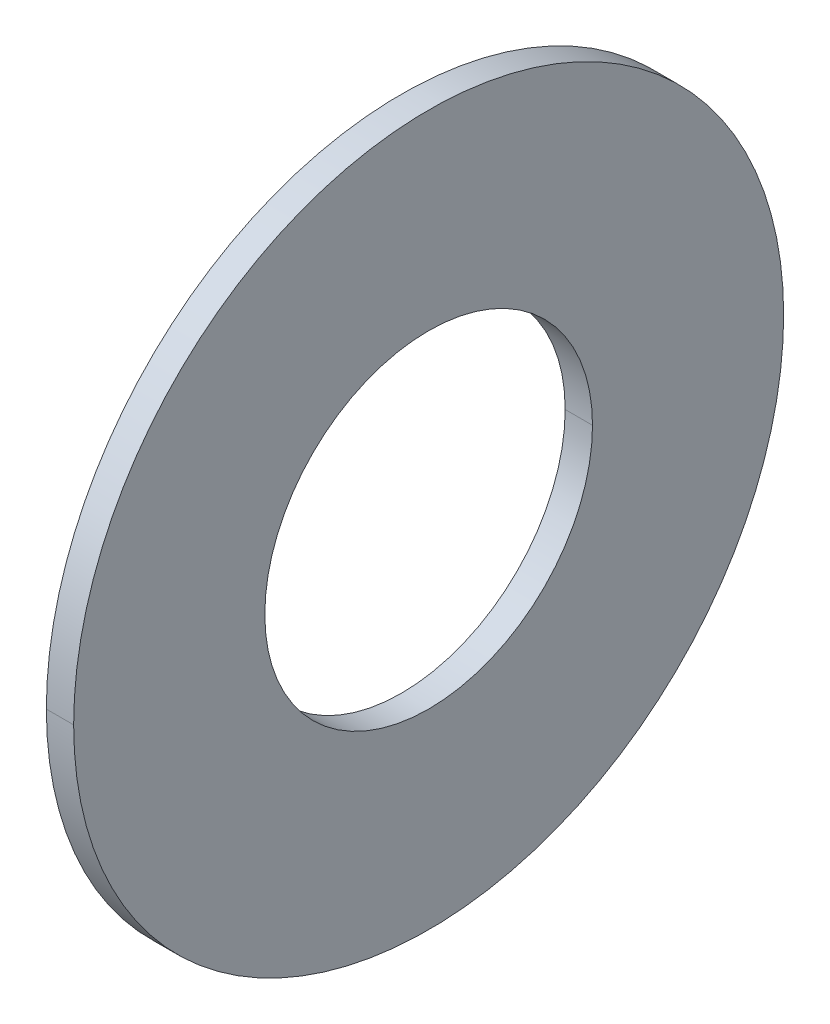
ISO-10303-21;
HEADER;
FILE_DESCRIPTION(('STEP AP214'),'2;1');
FILE_NAME('part.step','',(''),(''),'','','');
FILE_SCHEMA(('AUTOMOTIVE_DESIGN { 1 0 10303 214 1 1 1 1 }'));
ENDSEC;
DATA;
#1=APPLICATION_CONTEXT('core data for automotive mechanical design processes');
#2=APPLICATION_PROTOCOL_DEFINITION('international standard','automotive_design',2000,#1);
#3=PRODUCT_CONTEXT('',#1,'mechanical');
#4=PRODUCT('Part','Part','',(#3));
#5=PRODUCT_RELATED_PRODUCT_CATEGORY('part','',(#4));
#6=PRODUCT_DEFINITION_FORMATION('','',#4);
#7=PRODUCT_DEFINITION_CONTEXT('part definition',#1,'design');
#8=PRODUCT_DEFINITION('design','',#6,#7);
#9=PRODUCT_DEFINITION_SHAPE('','',#8);
#10=(LENGTH_UNIT() NAMED_UNIT(*) SI_UNIT(.MILLI.,.METRE.));
#11=(NAMED_UNIT(*) PLANE_ANGLE_UNIT() SI_UNIT($,.RADIAN.));
#12=(NAMED_UNIT(*) SI_UNIT($,.STERADIAN.) SOLID_ANGLE_UNIT());
#13=UNCERTAINTY_MEASURE_WITH_UNIT(LENGTH_MEASURE(1.E-05),#10,'distance_accuracy_value','');
#14=(GEOMETRIC_REPRESENTATION_CONTEXT(3) GLOBAL_UNCERTAINTY_ASSIGNED_CONTEXT((#13)) GLOBAL_UNIT_ASSIGNED_CONTEXT((#10,
#11,#12)) REPRESENTATION_CONTEXT('',''));
#15=CARTESIAN_POINT('',(0.,0.,0.));
#16=DIRECTION('',(0.,0.,1.));
#17=DIRECTION('',(1.,0.,0.));
#18=AXIS2_PLACEMENT_3D('',#15,#16,#17);
#19=CARTESIAN_POINT('',(1.,0.,0.));
#20=DIRECTION('',(-1.,0.,0.));
#21=DIRECTION('',(0.,0.,1.));
#22=AXIS2_PLACEMENT_3D('',#19,#20,#21);
#23=CYLINDRICAL_SURFACE('',#22,6.);
#24=CARTESIAN_POINT('',(1.,0.,0.));
#25=DIRECTION('',(1.,0.,0.));
#26=DIRECTION('',(0.,0.,-1.));
#27=AXIS2_PLACEMENT_3D('',#24,#25,#26);
#28=CIRCLE('',#27,6.);
#29=CARTESIAN_POINT('',(1.,0.,6.));
#30=VERTEX_POINT('',#29);
#31=CARTESIAN_POINT('',(1.,0.,-6.));
#32=VERTEX_POINT('',#31);
#33=EDGE_CURVE('E11',#30,#32,#28,.T.);
#34=ORIENTED_EDGE('',*,*,#33,.T.);
#35=DIRECTION('',(-1.,0.,0.));
#36=VECTOR('',#35,1.);
#37=CARTESIAN_POINT('',(1.,0.,-6.));
#38=LINE('',#37,#36);
#39=CARTESIAN_POINT('',(0.,0.,-6.));
#40=VERTEX_POINT('',#39);
#41=EDGE_CURVE('E26',#32,#40,#38,.T.);
#42=ORIENTED_EDGE('',*,*,#41,.T.);
#43=CARTESIAN_POINT('',(0.,0.,0.));
#44=DIRECTION('',(1.,0.,0.));
#45=DIRECTION('',(0.,0.,-1.));
#46=AXIS2_PLACEMENT_3D('',#43,#44,#45);
#47=CIRCLE('',#46,6.);
#48=CARTESIAN_POINT('',(0.,0.,6.));
#49=VERTEX_POINT('',#48);
#50=EDGE_CURVE('E100',#49,#40,#47,.T.);
#51=ORIENTED_EDGE('',*,*,#50,.F.);
#52=DIRECTION('',(-1.,0.,0.));
#53=VECTOR('',#52,1.);
#54=CARTESIAN_POINT('',(1.,0.,6.));
#55=LINE('',#54,#53);
#56=EDGE_CURVE('E95',#30,#49,#55,.T.);
#57=ORIENTED_EDGE('',*,*,#56,.F.);
#58=EDGE_LOOP('',(#34,#42,#51,#57));
#59=FACE_BOUND('',#58,.T.);
#60=ADVANCED_FACE('F16',(#59),#23,.F.);
#61=CARTESIAN_POINT('',(1.,0.,0.));
#62=DIRECTION('',(-1.,0.,0.));
#63=DIRECTION('',(0.,0.,1.));
#64=AXIS2_PLACEMENT_3D('',#61,#62,#63);
#65=CYLINDRICAL_SURFACE('',#64,13.);
#66=CARTESIAN_POINT('',(1.,0.,0.));
#67=DIRECTION('',(1.,0.,0.));
#68=DIRECTION('',(0.,0.,-1.));
#69=AXIS2_PLACEMENT_3D('',#66,#67,#68);
#70=CIRCLE('',#69,13.);
#71=CARTESIAN_POINT('',(1.,0.,-13.));
#72=VERTEX_POINT('',#71);
#73=CARTESIAN_POINT('',(1.,0.,13.));
#74=VERTEX_POINT('',#73);
#75=EDGE_CURVE('E103',#72,#74,#70,.T.);
#76=ORIENTED_EDGE('',*,*,#75,.F.);
#77=DIRECTION('',(-1.,0.,0.));
#78=VECTOR('',#77,1.);
#79=CARTESIAN_POINT('',(1.,0.,-13.));
#80=LINE('',#79,#78);
#81=CARTESIAN_POINT('',(0.,0.,-13.));
#82=VERTEX_POINT('',#81);
#83=EDGE_CURVE('E84',#72,#82,#80,.T.);
#84=ORIENTED_EDGE('',*,*,#83,.T.);
#85=CARTESIAN_POINT('',(0.,0.,0.));
#86=DIRECTION('',(1.,0.,0.));
#87=DIRECTION('',(0.,0.,-1.));
#88=AXIS2_PLACEMENT_3D('',#85,#86,#87);
#89=CIRCLE('',#88,13.);
#90=CARTESIAN_POINT('',(0.,0.,13.));
#91=VERTEX_POINT('',#90);
#92=EDGE_CURVE('E63',#82,#91,#89,.T.);
#93=ORIENTED_EDGE('',*,*,#92,.T.);
#94=DIRECTION('',(-1.,0.,0.));
#95=VECTOR('',#94,1.);
#96=CARTESIAN_POINT('',(1.,0.,13.));
#97=LINE('',#96,#95);
#98=EDGE_CURVE('E73',#74,#91,#97,.T.);
#99=ORIENTED_EDGE('',*,*,#98,.F.);
#100=EDGE_LOOP('',(#76,#84,#93,#99));
#101=FACE_BOUND('',#100,.T.);
#102=ADVANCED_FACE('F83',(#101),#65,.T.);
#103=CARTESIAN_POINT('',(1.,0.,0.));
#104=DIRECTION('',(1.,0.,0.));
#105=DIRECTION('',(0.,1.,0.));
#106=AXIS2_PLACEMENT_3D('',#103,#104,#105);
#107=PLANE('',#106);
#108=CARTESIAN_POINT('',(1.,0.,0.));
#109=DIRECTION('',(1.,0.,0.));
#110=DIRECTION('',(0.,0.,-1.));
#111=AXIS2_PLACEMENT_3D('',#108,#109,#110);
#112=CIRCLE('',#111,13.);
#113=EDGE_CURVE('E19',#74,#72,#112,.T.);
#114=ORIENTED_EDGE('',*,*,#113,.T.);
#115=ORIENTED_EDGE('',*,*,#75,.T.);
#116=EDGE_LOOP('',(#114,#115));
#117=FACE_BOUND('',#116,.T.);
#118=ORIENTED_EDGE('',*,*,#33,.F.);
#119=CARTESIAN_POINT('',(1.,0.,0.));
#120=DIRECTION('',(1.,0.,0.));
#121=DIRECTION('',(0.,0.,-1.));
#122=AXIS2_PLACEMENT_3D('',#119,#120,#121);
#123=CIRCLE('',#122,6.);
#124=EDGE_CURVE('E90',#32,#30,#123,.T.);
#125=ORIENTED_EDGE('',*,*,#124,.F.);
#126=EDGE_LOOP('',(#118,#125));
#127=FACE_BOUND('',#126,.T.);
#128=ADVANCED_FACE('F165',(#117,#127),#107,.T.);
#129=CARTESIAN_POINT('',(0.,0.,0.));
#130=DIRECTION('',(1.,0.,0.));
#131=DIRECTION('',(0.,1.,0.));
#132=AXIS2_PLACEMENT_3D('',#129,#130,#131);
#133=PLANE('',#132);
#134=CARTESIAN_POINT('',(0.,0.,0.));
#135=DIRECTION('',(1.,0.,0.));
#136=DIRECTION('',(0.,0.,-1.));
#137=AXIS2_PLACEMENT_3D('',#134,#135,#136);
#138=CIRCLE('',#137,13.);
#139=EDGE_CURVE('E76',#91,#82,#138,.T.);
#140=ORIENTED_EDGE('',*,*,#139,.F.);
#141=ORIENTED_EDGE('',*,*,#92,.F.);
#142=EDGE_LOOP('',(#140,#141));
#143=FACE_BOUND('',#142,.T.);
#144=ORIENTED_EDGE('',*,*,#50,.T.);
#145=CARTESIAN_POINT('',(0.,0.,0.));
#146=DIRECTION('',(1.,0.,0.));
#147=DIRECTION('',(0.,0.,-1.));
#148=AXIS2_PLACEMENT_3D('',#145,#146,#147);
#149=CIRCLE('',#148,6.);
#150=EDGE_CURVE('E81',#40,#49,#149,.T.);
#151=ORIENTED_EDGE('',*,*,#150,.T.);
#152=EDGE_LOOP('',(#144,#151));
#153=FACE_BOUND('',#152,.T.);
#154=ADVANCED_FACE('F87',(#143,#153),#133,.F.);
#155=CARTESIAN_POINT('',(1.,0.,0.));
#156=DIRECTION('',(-1.,0.,0.));
#157=DIRECTION('',(0.,0.,1.));
#158=AXIS2_PLACEMENT_3D('',#155,#156,#157);
#159=CYLINDRICAL_SURFACE('',#158,13.);
#160=ORIENTED_EDGE('',*,*,#83,.F.);
#161=ORIENTED_EDGE('',*,*,#113,.F.);
#162=ORIENTED_EDGE('',*,*,#98,.T.);
#163=ORIENTED_EDGE('',*,*,#139,.T.);
#164=EDGE_LOOP('',(#160,#161,#162,#163));
#165=FACE_BOUND('',#164,.T.);
#166=ADVANCED_FACE('F75',(#165),#159,.T.);
#167=CARTESIAN_POINT('',(1.,0.,0.));
#168=DIRECTION('',(-1.,0.,0.));
#169=DIRECTION('',(0.,0.,1.));
#170=AXIS2_PLACEMENT_3D('',#167,#168,#169);
#171=CYLINDRICAL_SURFACE('',#170,6.);
#172=ORIENTED_EDGE('',*,*,#41,.F.);
#173=ORIENTED_EDGE('',*,*,#124,.T.);
#174=ORIENTED_EDGE('',*,*,#56,.T.);
#175=ORIENTED_EDGE('',*,*,#150,.F.);
#176=EDGE_LOOP('',(#172,#173,#174,#175));
#177=FACE_BOUND('',#176,.T.);
#178=ADVANCED_FACE('F119',(#177),#171,.F.);
#179=CLOSED_SHELL('',(#60,#102,#128,#154,#166,#178));
#180=MANIFOLD_SOLID_BREP('B1',#179);
#181=ADVANCED_BREP_SHAPE_REPRESENTATION('',(#18,#180),#14);
#182=SHAPE_DEFINITION_REPRESENTATION(#9,#181);
ENDSEC;
END-ISO-10303-21;
